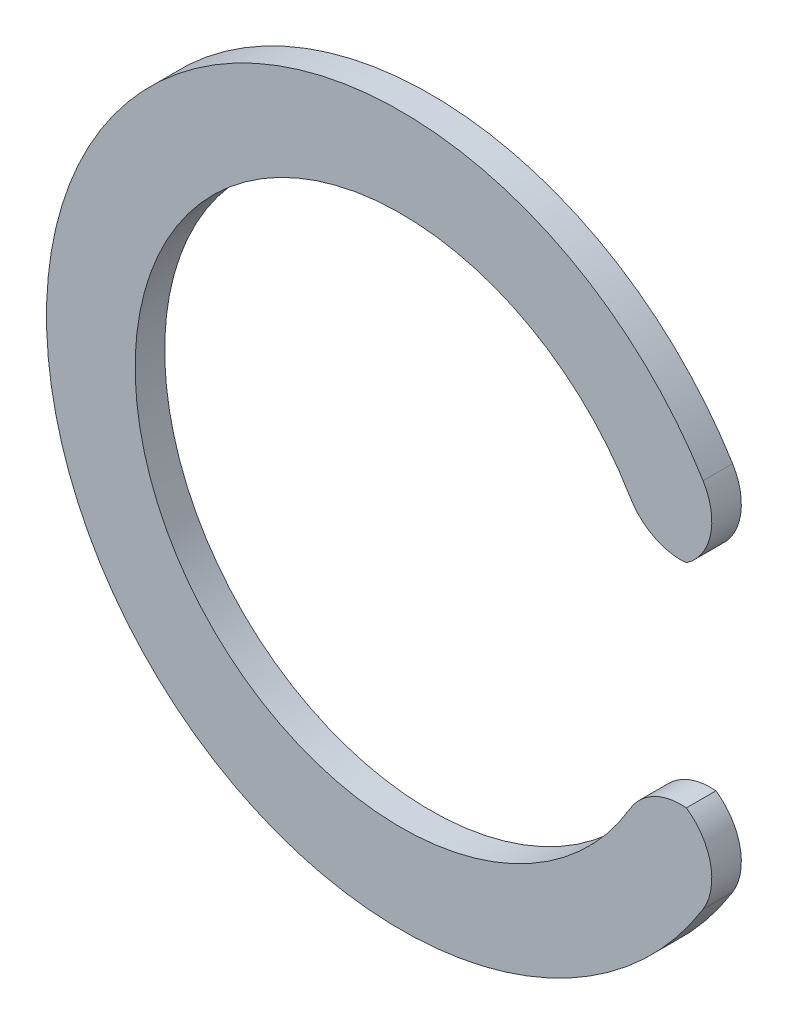
ISO-10303-21;
HEADER;
FILE_DESCRIPTION(('STEP AP214'),'2;1');
FILE_NAME('part.step','',(''),(''),'','','');
FILE_SCHEMA(('AUTOMOTIVE_DESIGN { 1 0 10303 214 1 1 1 1 }'));
ENDSEC;
DATA;
#1=APPLICATION_CONTEXT('core data for automotive mechanical design processes');
#2=APPLICATION_PROTOCOL_DEFINITION('international standard','automotive_design',2000,#1);
#3=PRODUCT_CONTEXT('',#1,'mechanical');
#4=PRODUCT('Part','Part','',(#3));
#5=PRODUCT_RELATED_PRODUCT_CATEGORY('part','',(#4));
#6=PRODUCT_DEFINITION_FORMATION('','',#4);
#7=PRODUCT_DEFINITION_CONTEXT('part definition',#1,'design');
#8=PRODUCT_DEFINITION('design','',#6,#7);
#9=PRODUCT_DEFINITION_SHAPE('','',#8);
#10=(LENGTH_UNIT() NAMED_UNIT(*) SI_UNIT(.MILLI.,.METRE.));
#11=(NAMED_UNIT(*) PLANE_ANGLE_UNIT() SI_UNIT($,.RADIAN.));
#12=(NAMED_UNIT(*) SI_UNIT($,.STERADIAN.) SOLID_ANGLE_UNIT());
#13=UNCERTAINTY_MEASURE_WITH_UNIT(LENGTH_MEASURE(1.E-05),#10,'distance_accuracy_value','');
#14=(GEOMETRIC_REPRESENTATION_CONTEXT(3) GLOBAL_UNCERTAINTY_ASSIGNED_CONTEXT((#13)) GLOBAL_UNIT_ASSIGNED_CONTEXT((#10,
#11,#12)) REPRESENTATION_CONTEXT('',''));
#15=CARTESIAN_POINT('',(0.,0.,0.));
#16=DIRECTION('',(0.,0.,1.));
#17=DIRECTION('',(1.,0.,0.));
#18=AXIS2_PLACEMENT_3D('',#15,#16,#17);
#19=CARTESIAN_POINT('',(0.,0.,0.5));
#20=DIRECTION('',(0.,0.,1.));
#21=DIRECTION('',(1.,0.,0.));
#22=AXIS2_PLACEMENT_3D('',#19,#20,#21);
#23=PLANE('',#22);
#24=CARTESIAN_POINT('',(4.26032860624721,-2.61717408033775,0.5));
#25=DIRECTION('',(0.,0.,1.));
#26=DIRECTION('',(1.,0.,0.));
#27=AXIS2_PLACEMENT_3D('',#24,#25,#26);
#28=CIRCLE('',#27,1.);
#29=CARTESIAN_POINT('',(5.11239432749665,-3.1406088964053,0.5));
#30=VERTEX_POINT('',#29);
#31=CARTESIAN_POINT('',(4.8307587793333,-1.79582797933467,0.5));
#32=VERTEX_POINT('',#31);
#33=EDGE_CURVE('E103',#30,#32,#28,.T.);
#34=ORIENTED_EDGE('',*,*,#33,.T.);
#35=CARTESIAN_POINT('',(4.73887959515118,-2.79159814132689,0.5));
#36=DIRECTION('',(0.,0.,1.));
#37=DIRECTION('',(1.,0.,0.));
#38=AXIS2_PLACEMENT_3D('',#35,#36,#37);
#39=CIRCLE('',#38,1.);
#40=CARTESIAN_POINT('',(3.87726512330551,-2.28403484290382,0.5));
#41=VERTEX_POINT('',#40);
#42=EDGE_CURVE('E116',#32,#41,#39,.T.);
#43=ORIENTED_EDGE('',*,*,#42,.T.);
#44=CARTESIAN_POINT('',(0.,0.,0.5));
#45=DIRECTION('',(0.,0.,1.));
#46=DIRECTION('',(1.,0.,0.));
#47=AXIS2_PLACEMENT_3D('',#44,#45,#46);
#48=CIRCLE('',#47,4.5);
#49=CARTESIAN_POINT('',(3.87726512330551,2.28403484290382,0.5));
#50=VERTEX_POINT('',#49);
#51=EDGE_CURVE('E111',#50,#41,#48,.T.);
#52=ORIENTED_EDGE('',*,*,#51,.F.);
#53=CARTESIAN_POINT('',(4.73887959515118,2.79159814132689,0.5));
#54=DIRECTION('',(0.,0.,1.));
#55=DIRECTION('',(1.,0.,0.));
#56=AXIS2_PLACEMENT_3D('',#53,#54,#55);
#57=CIRCLE('',#56,1.);
#58=CARTESIAN_POINT('',(4.8307587793333,1.79582797933466,0.5));
#59=VERTEX_POINT('',#58);
#60=EDGE_CURVE('E94',#50,#59,#57,.T.);
#61=ORIENTED_EDGE('',*,*,#60,.T.);
#62=CARTESIAN_POINT('',(4.26032860624721,2.61717408033775,0.5));
#63=DIRECTION('',(0.,0.,1.));
#64=DIRECTION('',(1.,0.,0.));
#65=AXIS2_PLACEMENT_3D('',#62,#63,#64);
#66=CIRCLE('',#65,1.);
#67=CARTESIAN_POINT('',(5.11239432749665,3.1406088964053,0.5));
#68=VERTEX_POINT('',#67);
#69=EDGE_CURVE('E104',#59,#68,#66,.T.);
#70=ORIENTED_EDGE('',*,*,#69,.T.);
#71=CARTESIAN_POINT('',(0.,0.,0.5));
#72=DIRECTION('',(0.,0.,1.));
#73=DIRECTION('',(1.,0.,0.));
#74=AXIS2_PLACEMENT_3D('',#71,#72,#73);
#75=CIRCLE('',#74,6.);
#76=EDGE_CURVE('E125',#68,#30,#75,.T.);
#77=ORIENTED_EDGE('',*,*,#76,.T.);
#78=EDGE_LOOP('',(#34,#43,#52,#61,#70,#77));
#79=FACE_BOUND('',#78,.T.);
#80=ADVANCED_FACE('F39',(#79),#23,.T.);
#81=CARTESIAN_POINT('',(0.,0.,0.));
#82=DIRECTION('',(0.,0.,1.));
#83=DIRECTION('',(1.,0.,0.));
#84=AXIS2_PLACEMENT_3D('',#81,#82,#83);
#85=PLANE('',#84);
#86=CARTESIAN_POINT('',(0.,0.,0.));
#87=DIRECTION('',(0.,0.,1.));
#88=DIRECTION('',(1.,0.,0.));
#89=AXIS2_PLACEMENT_3D('',#86,#87,#88);
#90=CIRCLE('',#89,4.5);
#91=CARTESIAN_POINT('',(3.87726512330551,2.28403484290382,0.));
#92=VERTEX_POINT('',#91);
#93=CARTESIAN_POINT('',(3.87726512330551,-2.28403484290382,0.));
#94=VERTEX_POINT('',#93);
#95=EDGE_CURVE('E113',#92,#94,#90,.T.);
#96=ORIENTED_EDGE('',*,*,#95,.T.);
#97=CARTESIAN_POINT('',(4.73887959515118,-2.79159814132689,0.));
#98=DIRECTION('',(0.,0.,1.));
#99=DIRECTION('',(1.,0.,0.));
#100=AXIS2_PLACEMENT_3D('',#97,#98,#99);
#101=CIRCLE('',#100,1.);
#102=CARTESIAN_POINT('',(4.8307587793333,-1.79582797933467,0.));
#103=VERTEX_POINT('',#102);
#104=EDGE_CURVE('E57',#94,#103,#101,.F.);
#105=ORIENTED_EDGE('',*,*,#104,.T.);
#106=CARTESIAN_POINT('',(4.26032860624721,-2.61717408033775,0.));
#107=DIRECTION('',(0.,0.,1.));
#108=DIRECTION('',(1.,0.,0.));
#109=AXIS2_PLACEMENT_3D('',#106,#107,#108);
#110=CIRCLE('',#109,1.);
#111=CARTESIAN_POINT('',(5.11239432749665,-3.1406088964053,0.));
#112=VERTEX_POINT('',#111);
#113=EDGE_CURVE('E146',#103,#112,#110,.F.);
#114=ORIENTED_EDGE('',*,*,#113,.T.);
#115=CARTESIAN_POINT('',(0.,0.,0.));
#116=DIRECTION('',(0.,0.,1.));
#117=DIRECTION('',(1.,0.,0.));
#118=AXIS2_PLACEMENT_3D('',#115,#116,#117);
#119=CIRCLE('',#118,6.);
#120=CARTESIAN_POINT('',(5.11239432749665,3.1406088964053,0.));
#121=VERTEX_POINT('',#120);
#122=EDGE_CURVE('E120',#121,#112,#119,.T.);
#123=ORIENTED_EDGE('',*,*,#122,.F.);
#124=CARTESIAN_POINT('',(4.26032860624721,2.61717408033775,0.));
#125=DIRECTION('',(0.,0.,1.));
#126=DIRECTION('',(1.,0.,0.));
#127=AXIS2_PLACEMENT_3D('',#124,#125,#126);
#128=CIRCLE('',#127,1.);
#129=CARTESIAN_POINT('',(4.8307587793333,1.79582797933466,0.));
#130=VERTEX_POINT('',#129);
#131=EDGE_CURVE('E64',#121,#130,#128,.F.);
#132=ORIENTED_EDGE('',*,*,#131,.T.);
#133=CARTESIAN_POINT('',(4.73887959515118,2.79159814132689,0.));
#134=DIRECTION('',(0.,0.,1.));
#135=DIRECTION('',(1.,0.,0.));
#136=AXIS2_PLACEMENT_3D('',#133,#134,#135);
#137=CIRCLE('',#136,1.);
#138=EDGE_CURVE('E143',#130,#92,#137,.F.);
#139=ORIENTED_EDGE('',*,*,#138,.T.);
#140=EDGE_LOOP('',(#96,#105,#114,#123,#132,#139));
#141=FACE_BOUND('',#140,.T.);
#142=ADVANCED_FACE('F162',(#141),#85,.F.);
#143=CARTESIAN_POINT('',(0.,0.,0.5));
#144=DIRECTION('',(0.,0.,-1.));
#145=DIRECTION('',(-1.,0.,0.));
#146=AXIS2_PLACEMENT_3D('',#143,#144,#145);
#147=CYLINDRICAL_SURFACE('',#146,6.);
#148=ORIENTED_EDGE('',*,*,#122,.T.);
#149=DIRECTION('',(0.,0.,-1.));
#150=VECTOR('',#149,1.);
#151=CARTESIAN_POINT('',(5.11239432749665,-3.1406088964053,0.5));
#152=LINE('',#151,#150);
#153=EDGE_CURVE('E11',#112,#30,#152,.F.);
#154=ORIENTED_EDGE('',*,*,#153,.T.);
#155=ORIENTED_EDGE('',*,*,#76,.F.);
#156=DIRECTION('',(0.,0.,-1.));
#157=VECTOR('',#156,1.);
#158=CARTESIAN_POINT('',(5.11239432749665,3.1406088964053,0.5));
#159=LINE('',#158,#157);
#160=EDGE_CURVE('E49',#68,#121,#159,.T.);
#161=ORIENTED_EDGE('',*,*,#160,.T.);
#162=EDGE_LOOP('',(#148,#154,#155,#161));
#163=FACE_BOUND('',#162,.T.);
#164=ADVANCED_FACE('F164',(#163),#147,.T.);
#165=CARTESIAN_POINT('',(0.,0.,0.5));
#166=DIRECTION('',(0.,0.,-1.));
#167=DIRECTION('',(-1.,0.,0.));
#168=AXIS2_PLACEMENT_3D('',#165,#166,#167);
#169=CYLINDRICAL_SURFACE('',#168,4.5);
#170=ORIENTED_EDGE('',*,*,#51,.T.);
#171=DIRECTION('',(0.,0.,-1.));
#172=VECTOR('',#171,1.);
#173=CARTESIAN_POINT('',(3.87726512330551,-2.28403484290382,0.5));
#174=LINE('',#173,#172);
#175=EDGE_CURVE('E115',#41,#94,#174,.T.);
#176=ORIENTED_EDGE('',*,*,#175,.T.);
#177=ORIENTED_EDGE('',*,*,#95,.F.);
#178=DIRECTION('',(0.,0.,-1.));
#179=VECTOR('',#178,1.);
#180=CARTESIAN_POINT('',(3.87726512330551,2.28403484290382,0.5));
#181=LINE('',#180,#179);
#182=EDGE_CURVE('E98',#92,#50,#181,.F.);
#183=ORIENTED_EDGE('',*,*,#182,.T.);
#184=EDGE_LOOP('',(#170,#176,#177,#183));
#185=FACE_BOUND('',#184,.T.);
#186=ADVANCED_FACE('F109',(#185),#169,.F.);
#187=CARTESIAN_POINT('',(4.26032860624721,-2.61717408033775,0.5));
#188=DIRECTION('',(0.,0.,-1.));
#189=DIRECTION('',(-1.,0.,0.));
#190=AXIS2_PLACEMENT_3D('',#187,#188,#189);
#191=CYLINDRICAL_SURFACE('',#190,1.);
#192=ORIENTED_EDGE('',*,*,#153,.F.);
#193=ORIENTED_EDGE('',*,*,#113,.F.);
#194=DIRECTION('',(0.,0.,-1.));
#195=VECTOR('',#194,1.);
#196=CARTESIAN_POINT('',(4.8307587793333,-1.79582797933467,0.25));
#197=LINE('',#196,#195);
#198=EDGE_CURVE('E127',#32,#103,#197,.T.);
#199=ORIENTED_EDGE('',*,*,#198,.F.);
#200=ORIENTED_EDGE('',*,*,#33,.F.);
#201=EDGE_LOOP('',(#192,#193,#199,#200));
#202=FACE_BOUND('',#201,.T.);
#203=ADVANCED_FACE('F161',(#202),#191,.T.);
#204=CARTESIAN_POINT('',(4.73887959515118,-2.79159814132689,0.5));
#205=DIRECTION('',(0.,0.,-1.));
#206=DIRECTION('',(-1.,0.,0.));
#207=AXIS2_PLACEMENT_3D('',#204,#205,#206);
#208=CYLINDRICAL_SURFACE('',#207,1.);
#209=ORIENTED_EDGE('',*,*,#104,.F.);
#210=ORIENTED_EDGE('',*,*,#175,.F.);
#211=ORIENTED_EDGE('',*,*,#42,.F.);
#212=ORIENTED_EDGE('',*,*,#198,.T.);
#213=EDGE_LOOP('',(#209,#210,#211,#212));
#214=FACE_BOUND('',#213,.T.);
#215=ADVANCED_FACE('F157',(#214),#208,.T.);
#216=CARTESIAN_POINT('',(4.26032860624721,2.61717408033775,0.5));
#217=DIRECTION('',(0.,0.,-1.));
#218=DIRECTION('',(-1.,0.,0.));
#219=AXIS2_PLACEMENT_3D('',#216,#217,#218);
#220=CYLINDRICAL_SURFACE('',#219,1.);
#221=DIRECTION('',(0.,0.,-1.));
#222=VECTOR('',#221,1.);
#223=CARTESIAN_POINT('',(4.8307587793333,1.79582797933466,0.25));
#224=LINE('',#223,#222);
#225=EDGE_CURVE('E43',#130,#59,#224,.F.);
#226=ORIENTED_EDGE('',*,*,#225,.F.);
#227=ORIENTED_EDGE('',*,*,#131,.F.);
#228=ORIENTED_EDGE('',*,*,#160,.F.);
#229=ORIENTED_EDGE('',*,*,#69,.F.);
#230=EDGE_LOOP('',(#226,#227,#228,#229));
#231=FACE_BOUND('',#230,.T.);
#232=ADVANCED_FACE('F41',(#231),#220,.T.);
#233=CARTESIAN_POINT('',(4.73887959515118,2.79159814132689,0.5));
#234=DIRECTION('',(0.,0.,-1.));
#235=DIRECTION('',(-1.,0.,0.));
#236=AXIS2_PLACEMENT_3D('',#233,#234,#235);
#237=CYLINDRICAL_SURFACE('',#236,1.);
#238=ORIENTED_EDGE('',*,*,#138,.F.);
#239=ORIENTED_EDGE('',*,*,#225,.T.);
#240=ORIENTED_EDGE('',*,*,#60,.F.);
#241=ORIENTED_EDGE('',*,*,#182,.F.);
#242=EDGE_LOOP('',(#238,#239,#240,#241));
#243=FACE_BOUND('',#242,.T.);
#244=ADVANCED_FACE('F97',(#243),#237,.T.);
#245=CLOSED_SHELL('',(#80,#142,#164,#186,#203,#215,#232,#244));
#246=MANIFOLD_SOLID_BREP('B2',#245);
#247=ADVANCED_BREP_SHAPE_REPRESENTATION('',(#18,#246),#14);
#248=SHAPE_DEFINITION_REPRESENTATION(#9,#247);
ENDSEC;
END-ISO-10303-21;
